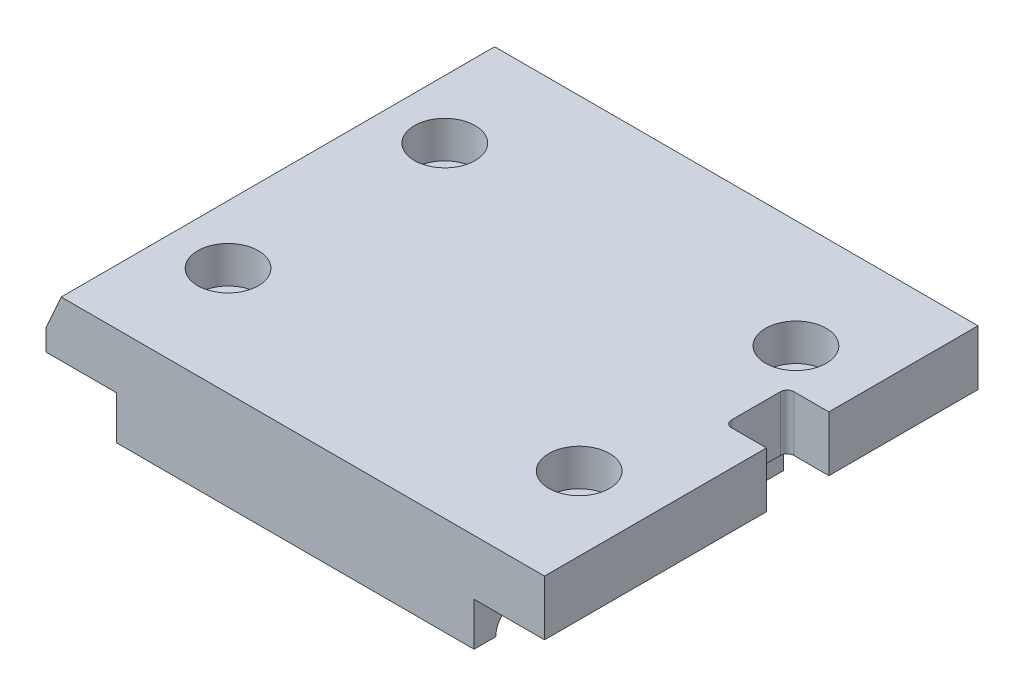
ISO-10303-21;
HEADER;
FILE_DESCRIPTION(('STEP AP214'),'2;1');
FILE_NAME('part.step','',(''),(''),'','','');
FILE_SCHEMA(('AUTOMOTIVE_DESIGN { 1 0 10303 214 1 1 1 1 }'));
ENDSEC;
DATA;
#1=APPLICATION_CONTEXT('core data for automotive mechanical design processes');
#2=APPLICATION_PROTOCOL_DEFINITION('international standard','automotive_design',2000,#1);
#3=PRODUCT_CONTEXT('',#1,'mechanical');
#4=PRODUCT('Part','Part','',(#3));
#5=PRODUCT_RELATED_PRODUCT_CATEGORY('part','',(#4));
#6=PRODUCT_DEFINITION_FORMATION('','',#4);
#7=PRODUCT_DEFINITION_CONTEXT('part definition',#1,'design');
#8=PRODUCT_DEFINITION('design','',#6,#7);
#9=PRODUCT_DEFINITION_SHAPE('','',#8);
#10=(LENGTH_UNIT() NAMED_UNIT(*) SI_UNIT(.MILLI.,.METRE.));
#11=(NAMED_UNIT(*) PLANE_ANGLE_UNIT() SI_UNIT($,.RADIAN.));
#12=(NAMED_UNIT(*) SI_UNIT($,.STERADIAN.) SOLID_ANGLE_UNIT());
#13=UNCERTAINTY_MEASURE_WITH_UNIT(LENGTH_MEASURE(1.E-05),#10,'distance_accuracy_value','');
#14=(GEOMETRIC_REPRESENTATION_CONTEXT(3) GLOBAL_UNCERTAINTY_ASSIGNED_CONTEXT((#13)) GLOBAL_UNIT_ASSIGNED_CONTEXT((#10,
#11,#12)) REPRESENTATION_CONTEXT('',''));
#15=CARTESIAN_POINT('',(0.,0.,0.));
#16=DIRECTION('',(0.,0.,1.));
#17=DIRECTION('',(1.,0.,0.));
#18=AXIS2_PLACEMENT_3D('',#15,#16,#17);
#19=CARTESIAN_POINT('',(23.,-36.1123422402632,-20.));
#20=DIRECTION('',(1.,0.,0.));
#21=DIRECTION('',(0.,0.,-1.));
#22=AXIS2_PLACEMENT_3D('',#19,#20,#21);
#23=PLANE('',#22);
#24=DIRECTION('',(0.,1.,0.));
#25=VECTOR('',#24,1.);
#26=CARTESIAN_POINT('',(23.,4.,-0.479999999999997));
#27=LINE('',#26,#25);
#28=CARTESIAN_POINT('',(23.,4.,-0.479999999999997));
#29=VERTEX_POINT('',#28);
#30=CARTESIAN_POINT('',(23.,9.1,-0.479999999999997));
#31=VERTEX_POINT('',#30);
#32=EDGE_CURVE('E292',#29,#31,#27,.T.);
#33=ORIENTED_EDGE('',*,*,#32,.T.);
#34=DIRECTION('',(0.,0.,-1.));
#35=VECTOR('',#34,1.);
#36=CARTESIAN_POINT('',(23.,9.1,-20.));
#37=LINE('',#36,#35);
#38=CARTESIAN_POINT('',(23.,9.1,20.));
#39=VERTEX_POINT('',#38);
#40=EDGE_CURVE('E310',#39,#31,#37,.T.);
#41=ORIENTED_EDGE('',*,*,#40,.F.);
#42=DIRECTION('',(0.,1.,0.));
#43=VECTOR('',#42,1.);
#44=CARTESIAN_POINT('',(23.,-36.1123422402632,20.));
#45=LINE('',#44,#43);
#46=CARTESIAN_POINT('',(23.,3.99999999999999,20.));
#47=VERTEX_POINT('',#46);
#48=EDGE_CURVE('E302',#47,#39,#45,.T.);
#49=ORIENTED_EDGE('',*,*,#48,.F.);
#50=DIRECTION('',(0.,0.,-1.));
#51=VECTOR('',#50,1.);
#52=CARTESIAN_POINT('',(23.,4.,-20.));
#53=LINE('',#52,#51);
#54=EDGE_CURVE('E281',#47,#29,#53,.T.);
#55=ORIENTED_EDGE('',*,*,#54,.T.);
#56=EDGE_LOOP('',(#33,#41,#49,#55));
#57=FACE_BOUND('',#56,.T.);
#58=ADVANCED_FACE('F96',(#57),#23,.T.);
#59=CARTESIAN_POINT('',(0.,0.,0.));
#60=DIRECTION('',(0.,1.,0.));
#61=DIRECTION('',(0.,0.,1.));
#62=AXIS2_PLACEMENT_3D('',#59,#60,#61);
#63=PLANE('',#62);
#64=DIRECTION('',(0.,0.,-1.));
#65=VECTOR('',#64,1.);
#66=CARTESIAN_POINT('',(-16.5,0.,0.));
#67=LINE('',#66,#65);
#68=CARTESIAN_POINT('',(-16.5,0.,20.));
#69=VERTEX_POINT('',#68);
#70=CARTESIAN_POINT('',(-16.5,0.,18.));
#71=VERTEX_POINT('',#70);
#72=EDGE_CURVE('E455',#69,#71,#67,.T.);
#73=ORIENTED_EDGE('',*,*,#72,.T.);
#74=DIRECTION('',(1.,0.,0.));
#75=VECTOR('',#74,1.);
#76=CARTESIAN_POINT('',(-23.,0.,18.));
#77=LINE('',#76,#75);
#78=CARTESIAN_POINT('',(16.5,0.,18.));
#79=VERTEX_POINT('',#78);
#80=EDGE_CURVE('E511',#71,#79,#77,.T.);
#81=ORIENTED_EDGE('',*,*,#80,.T.);
#82=DIRECTION('',(0.,0.,-1.));
#83=VECTOR('',#82,1.);
#84=CARTESIAN_POINT('',(16.5,0.,-20.));
#85=LINE('',#84,#83);
#86=CARTESIAN_POINT('',(16.5,0.,20.));
#87=VERTEX_POINT('',#86);
#88=EDGE_CURVE('E361',#87,#79,#85,.T.);
#89=ORIENTED_EDGE('',*,*,#88,.F.);
#90=DIRECTION('',(-1.,0.,0.));
#91=VECTOR('',#90,1.);
#92=CARTESIAN_POINT('',(0.,0.,20.));
#93=LINE('',#92,#91);
#94=EDGE_CURVE('E404',#87,#69,#93,.T.);
#95=ORIENTED_EDGE('',*,*,#94,.T.);
#96=EDGE_LOOP('',(#73,#81,#89,#95));
#97=FACE_BOUND('',#96,.T.);
#98=ADVANCED_FACE('F550',(#97),#63,.F.);
#99=CARTESIAN_POINT('',(16.5,0.,14.));
#100=VERTEX_POINT('',#99);
#101=CARTESIAN_POINT('',(16.5,0.,11.4696938456699));
#102=VERTEX_POINT('',#101);
#103=EDGE_CURVE('E357',#100,#102,#85,.T.);
#104=ORIENTED_EDGE('',*,*,#103,.F.);
#105=DIRECTION('',(1.,0.,0.));
#106=VECTOR('',#105,1.);
#107=CARTESIAN_POINT('',(-23.,0.,14.));
#108=LINE('',#107,#106);
#109=CARTESIAN_POINT('',(-16.5,0.,14.));
#110=VERTEX_POINT('',#109);
#111=EDGE_CURVE('E299',#100,#110,#108,.F.);
#112=ORIENTED_EDGE('',*,*,#111,.T.);
#113=CARTESIAN_POINT('',(-16.5,0.,11.4696938456699));
#114=VERTEX_POINT('',#113);
#115=EDGE_CURVE('E459',#110,#114,#67,.T.);
#116=ORIENTED_EDGE('',*,*,#115,.T.);
#117=CARTESIAN_POINT('',(-16.2,0.,10.));
#118=DIRECTION('',(0.,1.,0.));
#119=DIRECTION('',(0.,0.,1.));
#120=AXIS2_PLACEMENT_3D('',#117,#118,#119);
#121=CIRCLE('',#120,1.50000000000001);
#122=CARTESIAN_POINT('',(-16.5,0.,8.53030615433009));
#123=VERTEX_POINT('',#122);
#124=EDGE_CURVE('E427',#123,#114,#121,.F.);
#125=ORIENTED_EDGE('',*,*,#124,.F.);
#126=CARTESIAN_POINT('',(-16.5,0.,-8.53030615433009));
#127=VERTEX_POINT('',#126);
#128=EDGE_CURVE('E454',#123,#127,#67,.T.);
#129=ORIENTED_EDGE('',*,*,#128,.T.);
#130=CARTESIAN_POINT('',(-16.2,0.,-10.));
#131=DIRECTION('',(0.,1.,0.));
#132=DIRECTION('',(0.,0.,1.));
#133=AXIS2_PLACEMENT_3D('',#130,#131,#132);
#134=CIRCLE('',#133,1.50000000000001);
#135=CARTESIAN_POINT('',(-16.5,0.,-11.4696938456699));
#136=VERTEX_POINT('',#135);
#137=EDGE_CURVE('E430',#136,#127,#134,.F.);
#138=ORIENTED_EDGE('',*,*,#137,.F.);
#139=DIRECTION('',(0.,0.,1.));
#140=VECTOR('',#139,1.);
#141=CARTESIAN_POINT('',(-16.5,0.,-20.));
#142=LINE('',#141,#140);
#143=CARTESIAN_POINT('',(-16.5,0.,-14.));
#144=VERTEX_POINT('',#143);
#145=EDGE_CURVE('E319',#144,#136,#142,.T.);
#146=ORIENTED_EDGE('',*,*,#145,.F.);
#147=DIRECTION('',(1.,0.,0.));
#148=VECTOR('',#147,1.);
#149=CARTESIAN_POINT('',(-23.,0.,-14.));
#150=LINE('',#149,#148);
#151=CARTESIAN_POINT('',(16.5,0.,-14.));
#152=VERTEX_POINT('',#151);
#153=EDGE_CURVE('E499',#144,#152,#150,.T.);
#154=ORIENTED_EDGE('',*,*,#153,.T.);
#155=DIRECTION('',(0.,0.,1.));
#156=VECTOR('',#155,1.);
#157=CARTESIAN_POINT('',(16.5,0.,0.));
#158=LINE('',#157,#156);
#159=CARTESIAN_POINT('',(16.5,0.,-11.4696938456699));
#160=VERTEX_POINT('',#159);
#161=EDGE_CURVE('E451',#152,#160,#158,.T.);
#162=ORIENTED_EDGE('',*,*,#161,.T.);
#163=CARTESIAN_POINT('',(16.2,0.,-10.));
#164=DIRECTION('',(0.,1.,0.));
#165=DIRECTION('',(0.,0.,1.));
#166=AXIS2_PLACEMENT_3D('',#163,#164,#165);
#167=CIRCLE('',#166,1.5);
#168=CARTESIAN_POINT('',(16.5,0.,-8.53030615433009));
#169=VERTEX_POINT('',#168);
#170=EDGE_CURVE('E409',#160,#169,#167,.T.);
#171=ORIENTED_EDGE('',*,*,#170,.T.);
#172=CARTESIAN_POINT('',(16.5,0.,8.53030615433009));
#173=VERTEX_POINT('',#172);
#174=EDGE_CURVE('E446',#169,#173,#158,.T.);
#175=ORIENTED_EDGE('',*,*,#174,.T.);
#176=CARTESIAN_POINT('',(16.2,0.,10.));
#177=DIRECTION('',(0.,1.,0.));
#178=DIRECTION('',(0.,0.,1.));
#179=AXIS2_PLACEMENT_3D('',#176,#177,#178);
#180=CIRCLE('',#179,1.5);
#181=EDGE_CURVE('E424',#173,#102,#180,.T.);
#182=ORIENTED_EDGE('',*,*,#181,.T.);
#183=EDGE_LOOP('',(#104,#112,#116,#125,#129,#138,#146,#154,#162,#171,#175,#182));
#184=FACE_BOUND('',#183,.T.);
#185=ADVANCED_FACE('F556',(#184),#63,.F.);
#186=CARTESIAN_POINT('',(0.,5.7,0.));
#187=DIRECTION('',(0.,1.,0.));
#188=DIRECTION('',(0.,0.,1.));
#189=AXIS2_PLACEMENT_3D('',#186,#187,#188);
#190=PLANE('',#189);
#191=CARTESIAN_POINT('',(-16.2,5.7,10.));
#192=DIRECTION('',(0.,1.,0.));
#193=DIRECTION('',(0.,0.,1.));
#194=AXIS2_PLACEMENT_3D('',#191,#192,#193);
#195=CIRCLE('',#194,1.50000000000001);
#196=CARTESIAN_POINT('',(-16.2,5.7,11.5));
#197=VERTEX_POINT('',#196);
#198=EDGE_CURVE('E408',#197,#197,#195,.F.);
#199=ORIENTED_EDGE('',*,*,#198,.T.);
#200=EDGE_LOOP('',(#199));
#201=FACE_BOUND('',#200,.T.);
#202=CARTESIAN_POINT('',(-16.2,5.7,10.));
#203=DIRECTION('',(0.,1.,0.));
#204=DIRECTION('',(0.,0.,1.));
#205=AXIS2_PLACEMENT_3D('',#202,#203,#204);
#206=CIRCLE('',#205,2.8);
#207=CARTESIAN_POINT('',(-16.2,5.7,12.8));
#208=VERTEX_POINT('',#207);
#209=EDGE_CURVE('E443',#208,#208,#206,.F.);
#210=ORIENTED_EDGE('',*,*,#209,.F.);
#211=EDGE_LOOP('',(#210));
#212=FACE_BOUND('',#211,.T.);
#213=ADVANCED_FACE('F734',(#201,#212),#190,.T.);
#214=CARTESIAN_POINT('',(-16.2,5.7,-10.));
#215=DIRECTION('',(0.,1.,0.));
#216=DIRECTION('',(0.,0.,1.));
#217=AXIS2_PLACEMENT_3D('',#214,#215,#216);
#218=CIRCLE('',#217,1.50000000000001);
#219=CARTESIAN_POINT('',(-16.2,5.7,-8.49999999999999));
#220=VERTEX_POINT('',#219);
#221=EDGE_CURVE('E412',#220,#220,#218,.F.);
#222=ORIENTED_EDGE('',*,*,#221,.T.);
#223=EDGE_LOOP('',(#222));
#224=FACE_BOUND('',#223,.T.);
#225=CARTESIAN_POINT('',(-16.2,5.7,-10.));
#226=DIRECTION('',(0.,1.,0.));
#227=DIRECTION('',(0.,0.,1.));
#228=AXIS2_PLACEMENT_3D('',#225,#226,#227);
#229=CIRCLE('',#228,2.8);
#230=CARTESIAN_POINT('',(-16.2,5.7,-7.2));
#231=VERTEX_POINT('',#230);
#232=EDGE_CURVE('E440',#231,#231,#229,.F.);
#233=ORIENTED_EDGE('',*,*,#232,.F.);
#234=EDGE_LOOP('',(#233));
#235=FACE_BOUND('',#234,.T.);
#236=ADVANCED_FACE('F860',(#224,#235),#190,.T.);
#237=CARTESIAN_POINT('',(16.2,5.7,-10.));
#238=DIRECTION('',(0.,1.,0.));
#239=DIRECTION('',(0.,0.,1.));
#240=AXIS2_PLACEMENT_3D('',#237,#238,#239);
#241=CIRCLE('',#240,1.5);
#242=CARTESIAN_POINT('',(16.2,5.7,-8.5));
#243=VERTEX_POINT('',#242);
#244=EDGE_CURVE('E415',#243,#243,#241,.T.);
#245=ORIENTED_EDGE('',*,*,#244,.F.);
#246=EDGE_LOOP('',(#245));
#247=FACE_BOUND('',#246,.T.);
#248=CARTESIAN_POINT('',(16.2,5.7,-10.));
#249=DIRECTION('',(0.,1.,0.));
#250=DIRECTION('',(0.,0.,1.));
#251=AXIS2_PLACEMENT_3D('',#248,#249,#250);
#252=CIRCLE('',#251,2.8);
#253=CARTESIAN_POINT('',(16.2,5.7,-7.19999999999999));
#254=VERTEX_POINT('',#253);
#255=EDGE_CURVE('E437',#254,#254,#252,.F.);
#256=ORIENTED_EDGE('',*,*,#255,.F.);
#257=EDGE_LOOP('',(#256));
#258=FACE_BOUND('',#257,.T.);
#259=ADVANCED_FACE('F913',(#247,#258),#190,.T.);
#260=CARTESIAN_POINT('',(16.2,5.7,10.));
#261=DIRECTION('',(0.,1.,0.));
#262=DIRECTION('',(0.,0.,1.));
#263=AXIS2_PLACEMENT_3D('',#260,#261,#262);
#264=CIRCLE('',#263,1.5);
#265=CARTESIAN_POINT('',(16.2,5.7,11.5));
#266=VERTEX_POINT('',#265);
#267=EDGE_CURVE('E405',#266,#266,#264,.T.);
#268=ORIENTED_EDGE('',*,*,#267,.F.);
#269=EDGE_LOOP('',(#268));
#270=FACE_BOUND('',#269,.T.);
#271=CARTESIAN_POINT('',(16.2,5.7,10.));
#272=DIRECTION('',(0.,1.,0.));
#273=DIRECTION('',(0.,0.,1.));
#274=AXIS2_PLACEMENT_3D('',#271,#272,#273);
#275=CIRCLE('',#274,2.8);
#276=CARTESIAN_POINT('',(16.2,5.7,12.8));
#277=VERTEX_POINT('',#276);
#278=EDGE_CURVE('E418',#277,#277,#275,.F.);
#279=ORIENTED_EDGE('',*,*,#278,.F.);
#280=EDGE_LOOP('',(#279));
#281=FACE_BOUND('',#280,.T.);
#282=ADVANCED_FACE('F785',(#270,#281),#190,.T.);
#283=CARTESIAN_POINT('',(0.,5.7,20.));
#284=DIRECTION('',(0.,0.,1.));
#285=DIRECTION('',(1.,0.,0.));
#286=AXIS2_PLACEMENT_3D('',#283,#284,#285);
#287=PLANE('',#286);
#288=DIRECTION('',(1.,0.,0.));
#289=VECTOR('',#288,1.);
#290=CARTESIAN_POINT('',(0.,9.1,20.));
#291=LINE('',#290,#289);
#292=CARTESIAN_POINT('',(-21.6,9.1,20.));
#293=VERTEX_POINT('',#292);
#294=EDGE_CURVE('E402',#293,#39,#291,.T.);
#295=ORIENTED_EDGE('',*,*,#294,.F.);
#296=DIRECTION('',(-0.406736643075801,-0.913545457642601,0.));
#297=VECTOR('',#296,1.);
#298=CARTESIAN_POINT('',(-19.2899567519872,14.2884420843458,20.));
#299=LINE('',#298,#297);
#300=CARTESIAN_POINT('',(-23.,5.9555485165341,20.));
#301=VERTEX_POINT('',#300);
#302=EDGE_CURVE('E118',#293,#301,#299,.T.);
#303=ORIENTED_EDGE('',*,*,#302,.T.);
#304=DIRECTION('',(0.,1.,0.));
#305=VECTOR('',#304,1.);
#306=CARTESIAN_POINT('',(-23.,-36.1123422402632,20.));
#307=LINE('',#306,#305);
#308=CARTESIAN_POINT('',(-23.,4.,20.));
#309=VERTEX_POINT('',#308);
#310=EDGE_CURVE('E317',#309,#301,#307,.T.);
#311=ORIENTED_EDGE('',*,*,#310,.F.);
#312=DIRECTION('',(-1.,0.,0.));
#313=VECTOR('',#312,1.);
#314=CARTESIAN_POINT('',(-20.,4.,20.));
#315=LINE('',#314,#313);
#316=CARTESIAN_POINT('',(-16.5,4.,20.));
#317=VERTEX_POINT('',#316);
#318=EDGE_CURVE('E329',#317,#309,#315,.T.);
#319=ORIENTED_EDGE('',*,*,#318,.F.);
#320=DIRECTION('',(0.,-1.,0.));
#321=VECTOR('',#320,1.);
#322=CARTESIAN_POINT('',(-16.5,4.,20.));
#323=LINE('',#322,#321);
#324=EDGE_CURVE('E335',#317,#69,#323,.T.);
#325=ORIENTED_EDGE('',*,*,#324,.T.);
#326=ORIENTED_EDGE('',*,*,#94,.F.);
#327=DIRECTION('',(0.,-1.,0.));
#328=VECTOR('',#327,1.);
#329=CARTESIAN_POINT('',(16.5,4.,20.));
#330=LINE('',#329,#328);
#331=CARTESIAN_POINT('',(16.5,4.,20.));
#332=VERTEX_POINT('',#331);
#333=EDGE_CURVE('E369',#332,#87,#330,.T.);
#334=ORIENTED_EDGE('',*,*,#333,.F.);
#335=DIRECTION('',(-1.,0.,0.));
#336=VECTOR('',#335,1.);
#337=CARTESIAN_POINT('',(20.,4.,20.));
#338=LINE('',#337,#336);
#339=EDGE_CURVE('E358',#47,#332,#338,.T.);
#340=ORIENTED_EDGE('',*,*,#339,.F.);
#341=ORIENTED_EDGE('',*,*,#48,.T.);
#342=EDGE_LOOP('',(#295,#303,#311,#319,#325,#326,#334,#340,#341));
#343=FACE_BOUND('',#342,.T.);
#344=ADVANCED_FACE('F492',(#343),#287,.T.);
#345=CARTESIAN_POINT('',(-16.2,5.7,-10.));
#346=DIRECTION('',(0.,-1.,0.));
#347=DIRECTION('',(0.,0.,-1.));
#348=AXIS2_PLACEMENT_3D('',#345,#346,#347);
#349=CYLINDRICAL_SURFACE('',#348,1.50000000000001);
#350=ORIENTED_EDGE('',*,*,#137,.T.);
#351=DIRECTION('',(0.,-1.,0.));
#352=VECTOR('',#351,1.);
#353=CARTESIAN_POINT('',(-16.5,5.7,-8.53030615433009));
#354=LINE('',#353,#352);
#355=CARTESIAN_POINT('',(-16.5,4.,-8.53030615433009));
#356=VERTEX_POINT('',#355);
#357=EDGE_CURVE('E348',#127,#356,#354,.F.);
#358=ORIENTED_EDGE('',*,*,#357,.T.);
#359=CARTESIAN_POINT('',(-16.2,4.,-10.));
#360=DIRECTION('',(0.,1.,0.));
#361=DIRECTION('',(0.,0.,1.));
#362=AXIS2_PLACEMENT_3D('',#359,#360,#361);
#363=CIRCLE('',#362,1.50000000000001);
#364=CARTESIAN_POINT('',(-16.5,4.,-11.4696938456699));
#365=VERTEX_POINT('',#364);
#366=EDGE_CURVE('E354',#356,#365,#363,.F.);
#367=ORIENTED_EDGE('',*,*,#366,.T.);
#368=DIRECTION('',(0.,-1.,0.));
#369=VECTOR('',#368,1.);
#370=CARTESIAN_POINT('',(-16.5,5.7,-11.4696938456699));
#371=LINE('',#370,#369);
#372=EDGE_CURVE('E345',#365,#136,#371,.T.);
#373=ORIENTED_EDGE('',*,*,#372,.T.);
#374=EDGE_LOOP('',(#350,#358,#367,#373));
#375=FACE_BOUND('',#374,.T.);
#376=ORIENTED_EDGE('',*,*,#221,.F.);
#377=EDGE_LOOP('',(#376));
#378=FACE_BOUND('',#377,.T.);
#379=ADVANCED_FACE('F640',(#375,#378),#349,.F.);
#380=CARTESIAN_POINT('',(-16.2,5.7,10.));
#381=DIRECTION('',(0.,-1.,0.));
#382=DIRECTION('',(0.,0.,-1.));
#383=AXIS2_PLACEMENT_3D('',#380,#381,#382);
#384=CYLINDRICAL_SURFACE('',#383,1.50000000000001);
#385=ORIENTED_EDGE('',*,*,#124,.T.);
#386=DIRECTION('',(0.,-1.,0.));
#387=VECTOR('',#386,1.);
#388=CARTESIAN_POINT('',(-16.5,5.7,11.4696938456699));
#389=LINE('',#388,#387);
#390=CARTESIAN_POINT('',(-16.5,4.,11.4696938456699));
#391=VERTEX_POINT('',#390);
#392=EDGE_CURVE('E342',#114,#391,#389,.F.);
#393=ORIENTED_EDGE('',*,*,#392,.T.);
#394=CARTESIAN_POINT('',(-16.2,4.,10.));
#395=DIRECTION('',(0.,1.,0.));
#396=DIRECTION('',(0.,0.,1.));
#397=AXIS2_PLACEMENT_3D('',#394,#395,#396);
#398=CIRCLE('',#397,1.50000000000001);
#399=CARTESIAN_POINT('',(-16.5,4.,8.53030615433009));
#400=VERTEX_POINT('',#399);
#401=EDGE_CURVE('E351',#391,#400,#398,.F.);
#402=ORIENTED_EDGE('',*,*,#401,.T.);
#403=DIRECTION('',(0.,-1.,0.));
#404=VECTOR('',#403,1.);
#405=CARTESIAN_POINT('',(-16.5,5.7,8.53030615433009));
#406=LINE('',#405,#404);
#407=EDGE_CURVE('E338',#400,#123,#406,.T.);
#408=ORIENTED_EDGE('',*,*,#407,.T.);
#409=EDGE_LOOP('',(#385,#393,#402,#408));
#410=FACE_BOUND('',#409,.T.);
#411=ORIENTED_EDGE('',*,*,#198,.F.);
#412=EDGE_LOOP('',(#411));
#413=FACE_BOUND('',#412,.T.);
#414=ADVANCED_FACE('F596',(#410,#413),#384,.F.);
#415=CARTESIAN_POINT('',(16.2,5.7,10.));
#416=DIRECTION('',(0.,-1.,0.));
#417=DIRECTION('',(0.,0.,-1.));
#418=AXIS2_PLACEMENT_3D('',#415,#416,#417);
#419=CYLINDRICAL_SURFACE('',#418,1.5);
#420=DIRECTION('',(0.,-1.,0.));
#421=VECTOR('',#420,1.);
#422=CARTESIAN_POINT('',(16.5,5.7,8.53030615433009));
#423=LINE('',#422,#421);
#424=CARTESIAN_POINT('',(16.5,4.,8.53030615433009));
#425=VERTEX_POINT('',#424);
#426=EDGE_CURVE('E383',#425,#173,#423,.T.);
#427=ORIENTED_EDGE('',*,*,#426,.F.);
#428=CARTESIAN_POINT('',(16.2,4.,10.));
#429=DIRECTION('',(0.,-1.,0.));
#430=DIRECTION('',(0.,0.,-1.));
#431=AXIS2_PLACEMENT_3D('',#428,#429,#430);
#432=CIRCLE('',#431,1.5);
#433=CARTESIAN_POINT('',(16.5,4.,11.4696938456699));
#434=VERTEX_POINT('',#433);
#435=EDGE_CURVE('E385',#425,#434,#432,.T.);
#436=ORIENTED_EDGE('',*,*,#435,.T.);
#437=DIRECTION('',(0.,-1.,0.));
#438=VECTOR('',#437,1.);
#439=CARTESIAN_POINT('',(16.5,5.7,11.4696938456699));
#440=LINE('',#439,#438);
#441=EDGE_CURVE('E381',#102,#434,#440,.F.);
#442=ORIENTED_EDGE('',*,*,#441,.F.);
#443=ORIENTED_EDGE('',*,*,#181,.F.);
#444=EDGE_LOOP('',(#427,#436,#442,#443));
#445=FACE_BOUND('',#444,.T.);
#446=ORIENTED_EDGE('',*,*,#267,.T.);
#447=EDGE_LOOP('',(#446));
#448=FACE_BOUND('',#447,.T.);
#449=ADVANCED_FACE('F610',(#445,#448),#419,.F.);
#450=CARTESIAN_POINT('',(0.,5.7,-20.));
#451=DIRECTION('',(0.,0.,1.));
#452=DIRECTION('',(1.,0.,0.));
#453=AXIS2_PLACEMENT_3D('',#450,#451,#452);
#454=PLANE('',#453);
#455=DIRECTION('',(0.,1.,0.));
#456=VECTOR('',#455,1.);
#457=CARTESIAN_POINT('',(-23.,-36.1123422402632,-20.));
#458=LINE('',#457,#456);
#459=CARTESIAN_POINT('',(-23.,3.99999999999999,-20.));
#460=VERTEX_POINT('',#459);
#461=CARTESIAN_POINT('',(-23.,5.9555485165341,-20.));
#462=VERTEX_POINT('',#461);
#463=EDGE_CURVE('E307',#460,#462,#458,.T.);
#464=ORIENTED_EDGE('',*,*,#463,.T.);
#465=DIRECTION('',(0.406736643075801,0.913545457642601,0.));
#466=VECTOR('',#465,1.);
#467=CARTESIAN_POINT('',(-21.6,9.1,-20.));
#468=LINE('',#467,#466);
#469=CARTESIAN_POINT('',(-21.6,9.1,-20.));
#470=VERTEX_POINT('',#469);
#471=EDGE_CURVE('E12',#462,#470,#468,.T.);
#472=ORIENTED_EDGE('',*,*,#471,.T.);
#473=DIRECTION('',(1.,0.,0.));
#474=VECTOR('',#473,1.);
#475=CARTESIAN_POINT('',(0.,9.1,-20.));
#476=LINE('',#475,#474);
#477=CARTESIAN_POINT('',(23.,9.1,-20.));
#478=VERTEX_POINT('',#477);
#479=EDGE_CURVE('E400',#470,#478,#476,.T.);
#480=ORIENTED_EDGE('',*,*,#479,.T.);
#481=DIRECTION('',(0.,1.,0.));
#482=VECTOR('',#481,1.);
#483=CARTESIAN_POINT('',(23.,-36.1123422402632,-20.));
#484=LINE('',#483,#482);
#485=CARTESIAN_POINT('',(23.,4.,-20.));
#486=VERTEX_POINT('',#485);
#487=EDGE_CURVE('E303',#486,#478,#484,.T.);
#488=ORIENTED_EDGE('',*,*,#487,.F.);
#489=DIRECTION('',(1.,0.,0.));
#490=VECTOR('',#489,1.);
#491=CARTESIAN_POINT('',(20.,4.,-20.));
#492=LINE('',#491,#490);
#493=CARTESIAN_POINT('',(16.5,4.,-20.));
#494=VERTEX_POINT('',#493);
#495=EDGE_CURVE('E365',#494,#486,#492,.T.);
#496=ORIENTED_EDGE('',*,*,#495,.F.);
#497=DIRECTION('',(0.,-1.,0.));
#498=VECTOR('',#497,1.);
#499=CARTESIAN_POINT('',(16.5,4.,-20.));
#500=LINE('',#499,#498);
#501=CARTESIAN_POINT('',(16.5,0.,-20.));
#502=VERTEX_POINT('',#501);
#503=EDGE_CURVE('E372',#494,#502,#500,.T.);
#504=ORIENTED_EDGE('',*,*,#503,.T.);
#505=DIRECTION('',(-1.,0.,0.));
#506=VECTOR('',#505,1.);
#507=CARTESIAN_POINT('',(0.,0.,-20.));
#508=LINE('',#507,#506);
#509=CARTESIAN_POINT('',(-16.5,0.,-20.));
#510=VERTEX_POINT('',#509);
#511=EDGE_CURVE('E421',#502,#510,#508,.T.);
#512=ORIENTED_EDGE('',*,*,#511,.T.);
#513=DIRECTION('',(0.,-1.,0.));
#514=VECTOR('',#513,1.);
#515=CARTESIAN_POINT('',(-16.5,4.,-20.));
#516=LINE('',#515,#514);
#517=CARTESIAN_POINT('',(-16.5,4.,-20.));
#518=VERTEX_POINT('',#517);
#519=EDGE_CURVE('E332',#518,#510,#516,.T.);
#520=ORIENTED_EDGE('',*,*,#519,.F.);
#521=DIRECTION('',(1.,0.,0.));
#522=VECTOR('',#521,1.);
#523=CARTESIAN_POINT('',(-20.,4.,-20.));
#524=LINE('',#523,#522);
#525=EDGE_CURVE('E321',#460,#518,#524,.T.);
#526=ORIENTED_EDGE('',*,*,#525,.F.);
#527=EDGE_LOOP('',(#464,#472,#480,#488,#496,#504,#512,#520,#526));
#528=FACE_BOUND('',#527,.T.);
#529=ADVANCED_FACE('F630',(#528),#454,.F.);
#530=CARTESIAN_POINT('',(16.2,5.7,-10.));
#531=DIRECTION('',(0.,-1.,0.));
#532=DIRECTION('',(0.,0.,-1.));
#533=AXIS2_PLACEMENT_3D('',#530,#531,#532);
#534=CYLINDRICAL_SURFACE('',#533,1.5);
#535=DIRECTION('',(0.,-1.,0.));
#536=VECTOR('',#535,1.);
#537=CARTESIAN_POINT('',(16.5,5.7,-11.4696938456699));
#538=LINE('',#537,#536);
#539=CARTESIAN_POINT('',(16.5,4.,-11.4696938456699));
#540=VERTEX_POINT('',#539);
#541=EDGE_CURVE('E378',#540,#160,#538,.T.);
#542=ORIENTED_EDGE('',*,*,#541,.F.);
#543=CARTESIAN_POINT('',(16.2,4.,-10.));
#544=DIRECTION('',(0.,-1.,0.));
#545=DIRECTION('',(0.,0.,-1.));
#546=AXIS2_PLACEMENT_3D('',#543,#544,#545);
#547=CIRCLE('',#546,1.5);
#548=CARTESIAN_POINT('',(16.5,4.,-8.53030615433009));
#549=VERTEX_POINT('',#548);
#550=EDGE_CURVE('E450',#540,#549,#547,.T.);
#551=ORIENTED_EDGE('',*,*,#550,.T.);
#552=DIRECTION('',(0.,-1.,0.));
#553=VECTOR('',#552,1.);
#554=CARTESIAN_POINT('',(16.5,5.7,-8.53030615433009));
#555=LINE('',#554,#553);
#556=EDGE_CURVE('E375',#169,#549,#555,.F.);
#557=ORIENTED_EDGE('',*,*,#556,.F.);
#558=ORIENTED_EDGE('',*,*,#170,.F.);
#559=EDGE_LOOP('',(#542,#551,#557,#558));
#560=FACE_BOUND('',#559,.T.);
#561=ORIENTED_EDGE('',*,*,#244,.T.);
#562=EDGE_LOOP('',(#561));
#563=FACE_BOUND('',#562,.T.);
#564=ADVANCED_FACE('F624',(#560,#563),#534,.F.);
#565=CARTESIAN_POINT('',(16.5,0.,-18.));
#566=VERTEX_POINT('',#565);
#567=EDGE_CURVE('E447',#502,#566,#158,.T.);
#568=ORIENTED_EDGE('',*,*,#567,.T.);
#569=DIRECTION('',(1.,0.,0.));
#570=VECTOR('',#569,1.);
#571=CARTESIAN_POINT('',(-23.,0.,-18.));
#572=LINE('',#571,#570);
#573=CARTESIAN_POINT('',(-16.5,0.,-18.));
#574=VERTEX_POINT('',#573);
#575=EDGE_CURVE('E503',#566,#574,#572,.F.);
#576=ORIENTED_EDGE('',*,*,#575,.T.);
#577=EDGE_CURVE('E325',#510,#574,#142,.T.);
#578=ORIENTED_EDGE('',*,*,#577,.F.);
#579=ORIENTED_EDGE('',*,*,#511,.F.);
#580=EDGE_LOOP('',(#568,#576,#578,#579));
#581=FACE_BOUND('',#580,.T.);
#582=ADVANCED_FACE('F559',(#581),#63,.F.);
#583=CARTESIAN_POINT('',(0.,9.1,0.));
#584=DIRECTION('',(0.,-1.,0.));
#585=DIRECTION('',(0.,0.,-1.));
#586=AXIS2_PLACEMENT_3D('',#583,#584,#585);
#587=PLANE('',#586);
#588=ORIENTED_EDGE('',*,*,#479,.F.);
#589=DIRECTION('',(0.,0.,1.));
#590=VECTOR('',#589,1.);
#591=CARTESIAN_POINT('',(-21.6,9.1,20.));
#592=LINE('',#591,#590);
#593=EDGE_CURVE('E481',#470,#293,#592,.T.);
#594=ORIENTED_EDGE('',*,*,#593,.T.);
#595=ORIENTED_EDGE('',*,*,#294,.T.);
#596=ORIENTED_EDGE('',*,*,#40,.T.);
#597=DIRECTION('',(1.,0.,0.));
#598=VECTOR('',#597,1.);
#599=CARTESIAN_POINT('',(23.,9.1,-0.479999999999997));
#600=LINE('',#599,#598);
#601=CARTESIAN_POINT('',(19.77,9.1,-0.479999999999997));
#602=VERTEX_POINT('',#601);
#603=EDGE_CURVE('E295',#602,#31,#600,.T.);
#604=ORIENTED_EDGE('',*,*,#603,.F.);
#605=CARTESIAN_POINT('',(19.77,9.1,-1.1));
#606=DIRECTION('',(0.,-1.,0.));
#607=DIRECTION('',(0.,0.,-1.));
#608=AXIS2_PLACEMENT_3D('',#605,#606,#607);
#609=CIRCLE('',#608,0.62);
#610=CARTESIAN_POINT('',(19.15,9.1,-1.1));
#611=VERTEX_POINT('',#610);
#612=EDGE_CURVE('E478',#602,#611,#609,.T.);
#613=ORIENTED_EDGE('',*,*,#612,.T.);
#614=DIRECTION('',(0.,0.,1.));
#615=VECTOR('',#614,1.);
#616=CARTESIAN_POINT('',(19.15,9.1,-6.24));
#617=LINE('',#616,#615);
#618=CARTESIAN_POINT('',(19.15,9.1,-5.62));
#619=VERTEX_POINT('',#618);
#620=EDGE_CURVE('E519',#619,#611,#617,.T.);
#621=ORIENTED_EDGE('',*,*,#620,.F.);
#622=CARTESIAN_POINT('',(19.77,9.1,-5.62));
#623=DIRECTION('',(0.,-1.,0.));
#624=DIRECTION('',(0.,0.,-1.));
#625=AXIS2_PLACEMENT_3D('',#622,#623,#624);
#626=CIRCLE('',#625,0.62);
#627=CARTESIAN_POINT('',(19.77,9.1,-6.24));
#628=VERTEX_POINT('',#627);
#629=EDGE_CURVE('E474',#619,#628,#626,.T.);
#630=ORIENTED_EDGE('',*,*,#629,.T.);
#631=DIRECTION('',(-1.,0.,0.));
#632=VECTOR('',#631,1.);
#633=CARTESIAN_POINT('',(23.,9.1,-6.24));
#634=LINE('',#633,#632);
#635=CARTESIAN_POINT('',(23.,9.1,-6.24));
#636=VERTEX_POINT('',#635);
#637=EDGE_CURVE('E522',#636,#628,#634,.T.);
#638=ORIENTED_EDGE('',*,*,#637,.F.);
#639=EDGE_CURVE('E494',#636,#478,#37,.T.);
#640=ORIENTED_EDGE('',*,*,#639,.T.);
#641=EDGE_LOOP('',(#588,#594,#595,#596,#604,#613,#621,#630,#638,#640));
#642=FACE_BOUND('',#641,.T.);
#643=CARTESIAN_POINT('',(-16.2,9.1,10.));
#644=DIRECTION('',(0.,1.,0.));
#645=DIRECTION('',(0.,0.,1.));
#646=AXIS2_PLACEMENT_3D('',#643,#644,#645);
#647=CIRCLE('',#646,2.8);
#648=CARTESIAN_POINT('',(-16.2,9.1,12.8));
#649=VERTEX_POINT('',#648);
#650=EDGE_CURVE('E397',#649,#649,#647,.T.);
#651=ORIENTED_EDGE('',*,*,#650,.F.);
#652=EDGE_LOOP('',(#651));
#653=FACE_BOUND('',#652,.T.);
#654=CARTESIAN_POINT('',(-16.2,9.1,-10.));
#655=DIRECTION('',(0.,1.,0.));
#656=DIRECTION('',(0.,0.,1.));
#657=AXIS2_PLACEMENT_3D('',#654,#655,#656);
#658=CIRCLE('',#657,2.8);
#659=CARTESIAN_POINT('',(-16.2,9.1,-7.2));
#660=VERTEX_POINT('',#659);
#661=EDGE_CURVE('E394',#660,#660,#658,.T.);
#662=ORIENTED_EDGE('',*,*,#661,.F.);
#663=EDGE_LOOP('',(#662));
#664=FACE_BOUND('',#663,.T.);
#665=CARTESIAN_POINT('',(16.2,9.1,-10.));
#666=DIRECTION('',(0.,1.,0.));
#667=DIRECTION('',(0.,0.,1.));
#668=AXIS2_PLACEMENT_3D('',#665,#666,#667);
#669=CIRCLE('',#668,2.8);
#670=CARTESIAN_POINT('',(16.2,9.1,-7.19999999999999));
#671=VERTEX_POINT('',#670);
#672=EDGE_CURVE('E391',#671,#671,#669,.T.);
#673=ORIENTED_EDGE('',*,*,#672,.F.);
#674=EDGE_LOOP('',(#673));
#675=FACE_BOUND('',#674,.T.);
#676=CARTESIAN_POINT('',(16.2,9.1,10.));
#677=DIRECTION('',(0.,1.,0.));
#678=DIRECTION('',(0.,0.,1.));
#679=AXIS2_PLACEMENT_3D('',#676,#677,#678);
#680=CIRCLE('',#679,2.8);
#681=CARTESIAN_POINT('',(16.2,9.1,12.8));
#682=VERTEX_POINT('',#681);
#683=EDGE_CURVE('E388',#682,#682,#680,.T.);
#684=ORIENTED_EDGE('',*,*,#683,.F.);
#685=EDGE_LOOP('',(#684));
#686=FACE_BOUND('',#685,.T.);
#687=ADVANCED_FACE('F487',(#642,#653,#664,#675,#686),#587,.F.);
#688=CARTESIAN_POINT('',(-16.2,9.1,10.));
#689=DIRECTION('',(0.,-1.,0.));
#690=DIRECTION('',(0.,0.,-1.));
#691=AXIS2_PLACEMENT_3D('',#688,#689,#690);
#692=CYLINDRICAL_SURFACE('',#691,2.8);
#693=ORIENTED_EDGE('',*,*,#650,.T.);
#694=EDGE_LOOP('',(#693));
#695=FACE_BOUND('',#694,.T.);
#696=ORIENTED_EDGE('',*,*,#209,.T.);
#697=EDGE_LOOP('',(#696));
#698=FACE_BOUND('',#697,.T.);
#699=ADVANCED_FACE('F811',(#695,#698),#692,.F.);
#700=CARTESIAN_POINT('',(-16.2,9.1,-10.));
#701=DIRECTION('',(0.,-1.,0.));
#702=DIRECTION('',(0.,0.,-1.));
#703=AXIS2_PLACEMENT_3D('',#700,#701,#702);
#704=CYLINDRICAL_SURFACE('',#703,2.8);
#705=ORIENTED_EDGE('',*,*,#661,.T.);
#706=EDGE_LOOP('',(#705));
#707=FACE_BOUND('',#706,.T.);
#708=ORIENTED_EDGE('',*,*,#232,.T.);
#709=EDGE_LOOP('',(#708));
#710=FACE_BOUND('',#709,.T.);
#711=ADVANCED_FACE('F852',(#707,#710),#704,.F.);
#712=CARTESIAN_POINT('',(16.2,9.1,-10.));
#713=DIRECTION('',(0.,-1.,0.));
#714=DIRECTION('',(0.,0.,-1.));
#715=AXIS2_PLACEMENT_3D('',#712,#713,#714);
#716=CYLINDRICAL_SURFACE('',#715,2.8);
#717=ORIENTED_EDGE('',*,*,#672,.T.);
#718=EDGE_LOOP('',(#717));
#719=FACE_BOUND('',#718,.T.);
#720=ORIENTED_EDGE('',*,*,#255,.T.);
#721=EDGE_LOOP('',(#720));
#722=FACE_BOUND('',#721,.T.);
#723=ADVANCED_FACE('F848',(#719,#722),#716,.F.);
#724=CARTESIAN_POINT('',(16.2,9.1,10.));
#725=DIRECTION('',(0.,-1.,0.));
#726=DIRECTION('',(0.,0.,-1.));
#727=AXIS2_PLACEMENT_3D('',#724,#725,#726);
#728=CYLINDRICAL_SURFACE('',#727,2.8);
#729=ORIENTED_EDGE('',*,*,#683,.T.);
#730=EDGE_LOOP('',(#729));
#731=FACE_BOUND('',#730,.T.);
#732=ORIENTED_EDGE('',*,*,#278,.T.);
#733=EDGE_LOOP('',(#732));
#734=FACE_BOUND('',#733,.T.);
#735=ADVANCED_FACE('F845',(#731,#734),#728,.F.);
#736=CARTESIAN_POINT('',(16.5,4.,-20.));
#737=DIRECTION('',(-1.,0.,0.));
#738=DIRECTION('',(0.,0.,1.));
#739=AXIS2_PLACEMENT_3D('',#736,#737,#738);
#740=PLANE('',#739);
#741=ORIENTED_EDGE('',*,*,#426,.T.);
#742=ORIENTED_EDGE('',*,*,#174,.F.);
#743=ORIENTED_EDGE('',*,*,#556,.T.);
#744=DIRECTION('',(0.,0.,-1.));
#745=VECTOR('',#744,1.);
#746=CARTESIAN_POINT('',(16.5,4.,-20.));
#747=LINE('',#746,#745);
#748=EDGE_CURVE('E366',#425,#549,#747,.T.);
#749=ORIENTED_EDGE('',*,*,#748,.F.);
#750=EDGE_LOOP('',(#741,#742,#743,#749));
#751=FACE_BOUND('',#750,.T.);
#752=ADVANCED_FACE('F615',(#751),#740,.F.);
#753=ORIENTED_EDGE('',*,*,#161,.F.);
#754=CARTESIAN_POINT('',(16.5,0.,-16.));
#755=DIRECTION('',(-1.,0.,0.));
#756=DIRECTION('',(0.,0.,1.));
#757=AXIS2_PLACEMENT_3D('',#754,#755,#756);
#758=CIRCLE('',#757,2.);
#759=EDGE_CURVE('E495',#152,#566,#758,.T.);
#760=ORIENTED_EDGE('',*,*,#759,.T.);
#761=ORIENTED_EDGE('',*,*,#567,.F.);
#762=ORIENTED_EDGE('',*,*,#503,.F.);
#763=EDGE_CURVE('E360',#540,#494,#747,.T.);
#764=ORIENTED_EDGE('',*,*,#763,.F.);
#765=ORIENTED_EDGE('',*,*,#541,.T.);
#766=EDGE_LOOP('',(#753,#760,#761,#762,#764,#765));
#767=FACE_BOUND('',#766,.T.);
#768=ADVANCED_FACE('F621',(#767),#740,.F.);
#769=ORIENTED_EDGE('',*,*,#88,.T.);
#770=CARTESIAN_POINT('',(16.5,0.,16.));
#771=DIRECTION('',(-1.,0.,0.));
#772=DIRECTION('',(0.,0.,1.));
#773=AXIS2_PLACEMENT_3D('',#770,#771,#772);
#774=CIRCLE('',#773,2.);
#775=EDGE_CURVE('E508',#79,#100,#774,.T.);
#776=ORIENTED_EDGE('',*,*,#775,.T.);
#777=ORIENTED_EDGE('',*,*,#103,.T.);
#778=ORIENTED_EDGE('',*,*,#441,.T.);
#779=EDGE_CURVE('E362',#332,#434,#747,.T.);
#780=ORIENTED_EDGE('',*,*,#779,.F.);
#781=ORIENTED_EDGE('',*,*,#333,.T.);
#782=EDGE_LOOP('',(#769,#776,#777,#778,#780,#781));
#783=FACE_BOUND('',#782,.T.);
#784=ADVANCED_FACE('F604',(#783),#740,.F.);
#785=CARTESIAN_POINT('',(0.,4.,0.));
#786=DIRECTION('',(0.,-1.,0.));
#787=DIRECTION('',(0.,0.,-1.));
#788=AXIS2_PLACEMENT_3D('',#785,#786,#787);
#789=PLANE('',#788);
#790=DIRECTION('',(0.,0.,1.));
#791=VECTOR('',#790,1.);
#792=CARTESIAN_POINT('',(19.15,4.,-6.24));
#793=LINE('',#792,#791);
#794=CARTESIAN_POINT('',(19.15,4.,-5.62));
#795=VERTEX_POINT('',#794);
#796=CARTESIAN_POINT('',(19.15,4.,-1.1));
#797=VERTEX_POINT('',#796);
#798=EDGE_CURVE('E289',#795,#797,#793,.T.);
#799=ORIENTED_EDGE('',*,*,#798,.T.);
#800=CARTESIAN_POINT('',(19.77,4.,-1.1));
#801=DIRECTION('',(0.,-1.,0.));
#802=DIRECTION('',(0.,0.,-1.));
#803=AXIS2_PLACEMENT_3D('',#800,#801,#802);
#804=CIRCLE('',#803,0.62);
#805=CARTESIAN_POINT('',(19.77,4.,-0.479999999999997));
#806=VERTEX_POINT('',#805);
#807=EDGE_CURVE('E284',#797,#806,#804,.F.);
#808=ORIENTED_EDGE('',*,*,#807,.T.);
#809=DIRECTION('',(1.,0.,0.));
#810=VECTOR('',#809,1.);
#811=CARTESIAN_POINT('',(23.,4.,-0.479999999999997));
#812=LINE('',#811,#810);
#813=EDGE_CURVE('E275',#806,#29,#812,.T.);
#814=ORIENTED_EDGE('',*,*,#813,.T.);
#815=ORIENTED_EDGE('',*,*,#54,.F.);
#816=ORIENTED_EDGE('',*,*,#339,.T.);
#817=ORIENTED_EDGE('',*,*,#779,.T.);
#818=ORIENTED_EDGE('',*,*,#435,.F.);
#819=ORIENTED_EDGE('',*,*,#748,.T.);
#820=ORIENTED_EDGE('',*,*,#550,.F.);
#821=ORIENTED_EDGE('',*,*,#763,.T.);
#822=ORIENTED_EDGE('',*,*,#495,.T.);
#823=CARTESIAN_POINT('',(23.,4.,-6.24));
#824=VERTEX_POINT('',#823);
#825=EDGE_CURVE('E304',#824,#486,#53,.T.);
#826=ORIENTED_EDGE('',*,*,#825,.F.);
#827=DIRECTION('',(-1.,0.,0.));
#828=VECTOR('',#827,1.);
#829=CARTESIAN_POINT('',(23.,4.,-6.24));
#830=LINE('',#829,#828);
#831=CARTESIAN_POINT('',(19.77,4.,-6.24));
#832=VERTEX_POINT('',#831);
#833=EDGE_CURVE('E518',#824,#832,#830,.T.);
#834=ORIENTED_EDGE('',*,*,#833,.T.);
#835=CARTESIAN_POINT('',(19.77,4.,-5.62));
#836=DIRECTION('',(0.,-1.,0.));
#837=DIRECTION('',(0.,0.,-1.));
#838=AXIS2_PLACEMENT_3D('',#835,#836,#837);
#839=CIRCLE('',#838,0.62);
#840=EDGE_CURVE('E476',#832,#795,#839,.F.);
#841=ORIENTED_EDGE('',*,*,#840,.T.);
#842=EDGE_LOOP('',(#799,#808,#814,#815,#816,#817,#818,#819,#820,#821,#822,#826,#834,#841));
#843=FACE_BOUND('',#842,.T.);
#844=ADVANCED_FACE('F278',(#843),#789,.T.);
#845=CARTESIAN_POINT('',(0.,4.,0.));
#846=DIRECTION('',(0.,1.,0.));
#847=DIRECTION('',(0.,0.,1.));
#848=AXIS2_PLACEMENT_3D('',#845,#846,#847);
#849=PLANE('',#848);
#850=DIRECTION('',(0.,0.,1.));
#851=VECTOR('',#850,1.);
#852=CARTESIAN_POINT('',(-16.5,4.,-20.));
#853=LINE('',#852,#851);
#854=EDGE_CURVE('E330',#356,#400,#853,.T.);
#855=ORIENTED_EDGE('',*,*,#854,.T.);
#856=ORIENTED_EDGE('',*,*,#401,.F.);
#857=EDGE_CURVE('E324',#391,#317,#853,.T.);
#858=ORIENTED_EDGE('',*,*,#857,.T.);
#859=ORIENTED_EDGE('',*,*,#318,.T.);
#860=DIRECTION('',(0.,0.,1.));
#861=VECTOR('',#860,1.);
#862=CARTESIAN_POINT('',(-23.,4.,-20.));
#863=LINE('',#862,#861);
#864=EDGE_CURVE('E314',#460,#309,#863,.T.);
#865=ORIENTED_EDGE('',*,*,#864,.F.);
#866=ORIENTED_EDGE('',*,*,#525,.T.);
#867=EDGE_CURVE('E326',#518,#365,#853,.T.);
#868=ORIENTED_EDGE('',*,*,#867,.T.);
#869=ORIENTED_EDGE('',*,*,#366,.F.);
#870=EDGE_LOOP('',(#855,#856,#858,#859,#865,#866,#868,#869));
#871=FACE_BOUND('',#870,.T.);
#872=ADVANCED_FACE('F634',(#871),#849,.F.);
#873=CARTESIAN_POINT('',(-16.5,4.,-20.));
#874=DIRECTION('',(1.,0.,0.));
#875=DIRECTION('',(0.,0.,-1.));
#876=AXIS2_PLACEMENT_3D('',#873,#874,#875);
#877=PLANE('',#876);
#878=ORIENTED_EDGE('',*,*,#128,.F.);
#879=ORIENTED_EDGE('',*,*,#407,.F.);
#880=ORIENTED_EDGE('',*,*,#854,.F.);
#881=ORIENTED_EDGE('',*,*,#357,.F.);
#882=EDGE_LOOP('',(#878,#879,#880,#881));
#883=FACE_BOUND('',#882,.T.);
#884=ADVANCED_FACE('F644',(#883),#877,.F.);
#885=ORIENTED_EDGE('',*,*,#577,.T.);
#886=CARTESIAN_POINT('',(-16.5,0.,-16.));
#887=DIRECTION('',(1.,0.,0.));
#888=DIRECTION('',(0.,0.,-1.));
#889=AXIS2_PLACEMENT_3D('',#886,#887,#888);
#890=CIRCLE('',#889,2.);
#891=EDGE_CURVE('E458',#574,#144,#890,.T.);
#892=ORIENTED_EDGE('',*,*,#891,.T.);
#893=ORIENTED_EDGE('',*,*,#145,.T.);
#894=ORIENTED_EDGE('',*,*,#372,.F.);
#895=ORIENTED_EDGE('',*,*,#867,.F.);
#896=ORIENTED_EDGE('',*,*,#519,.T.);
#897=EDGE_LOOP('',(#885,#892,#893,#894,#895,#896));
#898=FACE_BOUND('',#897,.T.);
#899=ADVANCED_FACE('F637',(#898),#877,.F.);
#900=ORIENTED_EDGE('',*,*,#115,.F.);
#901=CARTESIAN_POINT('',(-16.5,0.,16.));
#902=DIRECTION('',(1.,0.,0.));
#903=DIRECTION('',(0.,0.,-1.));
#904=AXIS2_PLACEMENT_3D('',#901,#902,#903);
#905=CIRCLE('',#904,2.);
#906=EDGE_CURVE('E462',#110,#71,#905,.T.);
#907=ORIENTED_EDGE('',*,*,#906,.T.);
#908=ORIENTED_EDGE('',*,*,#72,.F.);
#909=ORIENTED_EDGE('',*,*,#324,.F.);
#910=ORIENTED_EDGE('',*,*,#857,.F.);
#911=ORIENTED_EDGE('',*,*,#392,.F.);
#912=EDGE_LOOP('',(#900,#907,#908,#909,#910,#911));
#913=FACE_BOUND('',#912,.T.);
#914=ADVANCED_FACE('F572',(#913),#877,.F.);
#915=CARTESIAN_POINT('',(-23.,-36.1123422402632,-20.));
#916=DIRECTION('',(-1.,0.,0.));
#917=DIRECTION('',(0.,0.,1.));
#918=AXIS2_PLACEMENT_3D('',#915,#916,#917);
#919=PLANE('',#918);
#920=ORIENTED_EDGE('',*,*,#310,.T.);
#921=DIRECTION('',(0.,0.,-1.));
#922=VECTOR('',#921,1.);
#923=CARTESIAN_POINT('',(-23.,5.95554851653411,-20.));
#924=LINE('',#923,#922);
#925=EDGE_CURVE('E104',#301,#462,#924,.T.);
#926=ORIENTED_EDGE('',*,*,#925,.T.);
#927=ORIENTED_EDGE('',*,*,#463,.F.);
#928=ORIENTED_EDGE('',*,*,#864,.T.);
#929=EDGE_LOOP('',(#920,#926,#927,#928));
#930=FACE_BOUND('',#929,.T.);
#931=ADVANCED_FACE('F564',(#930),#919,.T.);
#932=DIRECTION('',(0.,1.,0.));
#933=VECTOR('',#932,1.);
#934=CARTESIAN_POINT('',(23.,4.,-6.24));
#935=LINE('',#934,#933);
#936=EDGE_CURVE('E288',#824,#636,#935,.T.);
#937=ORIENTED_EDGE('',*,*,#936,.F.);
#938=ORIENTED_EDGE('',*,*,#825,.T.);
#939=ORIENTED_EDGE('',*,*,#487,.T.);
#940=ORIENTED_EDGE('',*,*,#639,.F.);
#941=EDGE_LOOP('',(#937,#938,#939,#940));
#942=FACE_BOUND('',#941,.T.);
#943=ADVANCED_FACE('F552',(#942),#23,.T.);
#944=CARTESIAN_POINT('',(-23.,0.,-16.));
#945=DIRECTION('',(1.,0.,0.));
#946=DIRECTION('',(0.,0.,-1.));
#947=AXIS2_PLACEMENT_3D('',#944,#945,#946);
#948=CYLINDRICAL_SURFACE('',#947,2.);
#949=ORIENTED_EDGE('',*,*,#153,.F.);
#950=ORIENTED_EDGE('',*,*,#891,.F.);
#951=ORIENTED_EDGE('',*,*,#575,.F.);
#952=ORIENTED_EDGE('',*,*,#759,.F.);
#953=EDGE_LOOP('',(#949,#950,#951,#952));
#954=FACE_BOUND('',#953,.T.);
#955=ADVANCED_FACE('F563',(#954),#948,.F.);
#956=CARTESIAN_POINT('',(-23.,0.,16.));
#957=DIRECTION('',(1.,0.,0.));
#958=DIRECTION('',(0.,0.,-1.));
#959=AXIS2_PLACEMENT_3D('',#956,#957,#958);
#960=CYLINDRICAL_SURFACE('',#959,2.);
#961=ORIENTED_EDGE('',*,*,#80,.F.);
#962=ORIENTED_EDGE('',*,*,#906,.F.);
#963=ORIENTED_EDGE('',*,*,#111,.F.);
#964=ORIENTED_EDGE('',*,*,#775,.F.);
#965=EDGE_LOOP('',(#961,#962,#963,#964));
#966=FACE_BOUND('',#965,.T.);
#967=ADVANCED_FACE('F570',(#966),#960,.F.);
#968=CARTESIAN_POINT('',(23.,4.,-0.479999999999997));
#969=DIRECTION('',(0.,0.,1.));
#970=DIRECTION('',(1.,0.,0.));
#971=AXIS2_PLACEMENT_3D('',#968,#969,#970);
#972=PLANE('',#971);
#973=ORIENTED_EDGE('',*,*,#813,.F.);
#974=DIRECTION('',(0.,1.,0.));
#975=VECTOR('',#974,1.);
#976=CARTESIAN_POINT('',(19.77,9.1,-0.479999999999997));
#977=LINE('',#976,#975);
#978=EDGE_CURVE('E472',#806,#602,#977,.T.);
#979=ORIENTED_EDGE('',*,*,#978,.T.);
#980=ORIENTED_EDGE('',*,*,#603,.T.);
#981=ORIENTED_EDGE('',*,*,#32,.F.);
#982=EDGE_LOOP('',(#973,#979,#980,#981));
#983=FACE_BOUND('',#982,.T.);
#984=ADVANCED_FACE('F293',(#983),#972,.F.);
#985=CARTESIAN_POINT('',(19.15,4.,-6.24));
#986=DIRECTION('',(-1.,0.,0.));
#987=DIRECTION('',(0.,0.,1.));
#988=AXIS2_PLACEMENT_3D('',#985,#986,#987);
#989=PLANE('',#988);
#990=ORIENTED_EDGE('',*,*,#798,.F.);
#991=DIRECTION('',(0.,1.,0.));
#992=VECTOR('',#991,1.);
#993=CARTESIAN_POINT('',(19.15,9.1,-5.62));
#994=LINE('',#993,#992);
#995=EDGE_CURVE('E467',#795,#619,#994,.T.);
#996=ORIENTED_EDGE('',*,*,#995,.T.);
#997=ORIENTED_EDGE('',*,*,#620,.T.);
#998=DIRECTION('',(0.,1.,0.));
#999=VECTOR('',#998,1.);
#1000=CARTESIAN_POINT('',(19.15,4.,-1.1));
#1001=LINE('',#1000,#999);
#1002=EDGE_CURVE('E465',#611,#797,#1001,.F.);
#1003=ORIENTED_EDGE('',*,*,#1002,.T.);
#1004=EDGE_LOOP('',(#990,#996,#997,#1003));
#1005=FACE_BOUND('',#1004,.T.);
#1006=ADVANCED_FACE('F538',(#1005),#989,.F.);
#1007=CARTESIAN_POINT('',(23.,4.,-6.24));
#1008=DIRECTION('',(0.,0.,-1.));
#1009=DIRECTION('',(-1.,0.,0.));
#1010=AXIS2_PLACEMENT_3D('',#1007,#1008,#1009);
#1011=PLANE('',#1010);
#1012=ORIENTED_EDGE('',*,*,#637,.T.);
#1013=DIRECTION('',(0.,1.,0.));
#1014=VECTOR('',#1013,1.);
#1015=CARTESIAN_POINT('',(19.77,4.,-6.24));
#1016=LINE('',#1015,#1014);
#1017=EDGE_CURVE('E470',#628,#832,#1016,.F.);
#1018=ORIENTED_EDGE('',*,*,#1017,.T.);
#1019=ORIENTED_EDGE('',*,*,#833,.F.);
#1020=ORIENTED_EDGE('',*,*,#936,.T.);
#1021=EDGE_LOOP('',(#1012,#1018,#1019,#1020));
#1022=FACE_BOUND('',#1021,.T.);
#1023=ADVANCED_FACE('F547',(#1022),#1011,.F.);
#1024=CARTESIAN_POINT('',(19.77,4.,-5.62));
#1025=DIRECTION('',(0.,-1.,0.));
#1026=DIRECTION('',(0.,0.,-1.));
#1027=AXIS2_PLACEMENT_3D('',#1024,#1025,#1026);
#1028=CYLINDRICAL_SURFACE('',#1027,0.62);
#1029=ORIENTED_EDGE('',*,*,#840,.F.);
#1030=ORIENTED_EDGE('',*,*,#1017,.F.);
#1031=ORIENTED_EDGE('',*,*,#629,.F.);
#1032=ORIENTED_EDGE('',*,*,#995,.F.);
#1033=EDGE_LOOP('',(#1029,#1030,#1031,#1032));
#1034=FACE_BOUND('',#1033,.T.);
#1035=ADVANCED_FACE('F535',(#1034),#1028,.F.);
#1036=CARTESIAN_POINT('',(19.77,4.,-1.1));
#1037=DIRECTION('',(0.,-1.,0.));
#1038=DIRECTION('',(0.,0.,-1.));
#1039=AXIS2_PLACEMENT_3D('',#1036,#1037,#1038);
#1040=CYLINDRICAL_SURFACE('',#1039,0.62);
#1041=ORIENTED_EDGE('',*,*,#807,.F.);
#1042=ORIENTED_EDGE('',*,*,#1002,.F.);
#1043=ORIENTED_EDGE('',*,*,#612,.F.);
#1044=ORIENTED_EDGE('',*,*,#978,.F.);
#1045=EDGE_LOOP('',(#1041,#1042,#1043,#1044));
#1046=FACE_BOUND('',#1045,.T.);
#1047=ADVANCED_FACE('F541',(#1046),#1040,.F.);
#1048=CARTESIAN_POINT('',(-21.6,9.1,0.));
#1049=DIRECTION('',(-0.913545457642601,0.406736643075801,0.));
#1050=DIRECTION('',(0.,0.,-1.));
#1051=AXIS2_PLACEMENT_3D('',#1048,#1049,#1050);
#1052=PLANE('',#1051);
#1053=ORIENTED_EDGE('',*,*,#471,.F.);
#1054=ORIENTED_EDGE('',*,*,#925,.F.);
#1055=ORIENTED_EDGE('',*,*,#302,.F.);
#1056=ORIENTED_EDGE('',*,*,#593,.F.);
#1057=EDGE_LOOP('',(#1053,#1054,#1055,#1056));
#1058=FACE_BOUND('',#1057,.T.);
#1059=ADVANCED_FACE('F98',(#1058),#1052,.T.);
#1060=CLOSED_SHELL('',(#58,#98,#185,#213,#236,#259,#282,#344,#379,#414,#449,#529,#564,#582,#687,
#699,#711,#723,#735,#752,#768,#784,#844,#872,#884,#899,#914,#931,#943,#955,#967,#984,#1006,
#1023,#1035,#1047,#1059));
#1061=MANIFOLD_SOLID_BREP('B2',#1060);
#1062=ADVANCED_BREP_SHAPE_REPRESENTATION('',(#18,#1061),#14);
#1063=SHAPE_DEFINITION_REPRESENTATION(#9,#1062);
ENDSEC;
END-ISO-10303-21;
